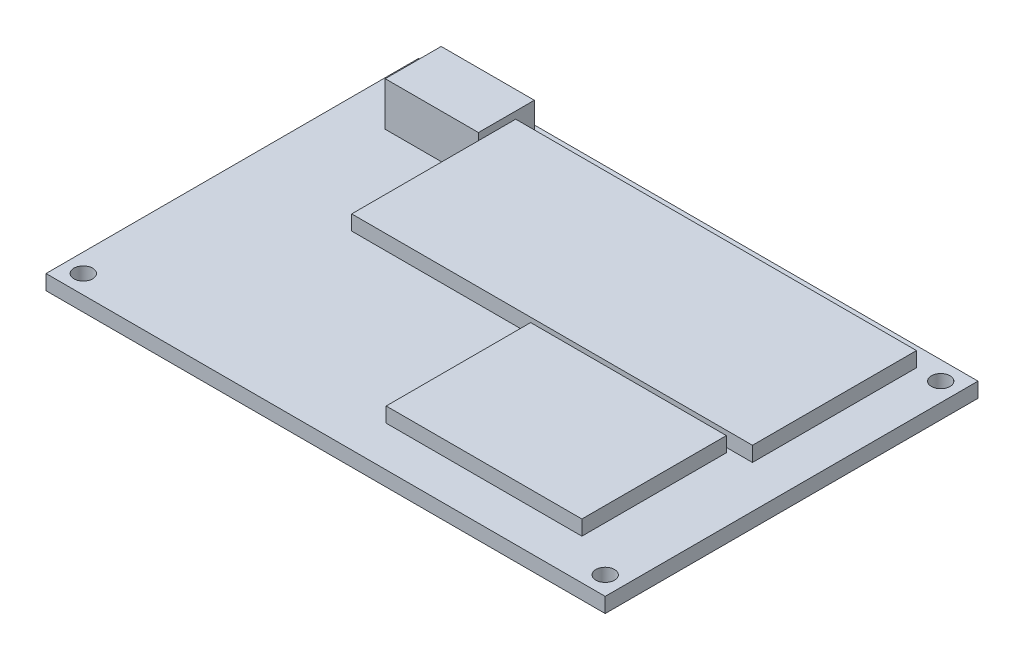
ISO-10303-21;
HEADER;
FILE_DESCRIPTION(('STEP AP214'),'2;1');
FILE_NAME('part.step','',(''),(''),'','','');
FILE_SCHEMA(('AUTOMOTIVE_DESIGN { 1 0 10303 214 1 1 1 1 }'));
ENDSEC;
DATA;
#1=APPLICATION_CONTEXT('core data for automotive mechanical design processes');
#2=APPLICATION_PROTOCOL_DEFINITION('international standard','automotive_design',2000,#1);
#3=PRODUCT_CONTEXT('',#1,'mechanical');
#4=PRODUCT('Part','Part','',(#3));
#5=PRODUCT_RELATED_PRODUCT_CATEGORY('part','',(#4));
#6=PRODUCT_DEFINITION_FORMATION('','',#4);
#7=PRODUCT_DEFINITION_CONTEXT('part definition',#1,'design');
#8=PRODUCT_DEFINITION('design','',#6,#7);
#9=PRODUCT_DEFINITION_SHAPE('','',#8);
#10=(LENGTH_UNIT() NAMED_UNIT(*) SI_UNIT(.MILLI.,.METRE.));
#11=(NAMED_UNIT(*) PLANE_ANGLE_UNIT() SI_UNIT($,.RADIAN.));
#12=(NAMED_UNIT(*) SI_UNIT($,.STERADIAN.) SOLID_ANGLE_UNIT());
#13=UNCERTAINTY_MEASURE_WITH_UNIT(LENGTH_MEASURE(1.E-05),#10,'distance_accuracy_value','');
#14=(GEOMETRIC_REPRESENTATION_CONTEXT(3) GLOBAL_UNCERTAINTY_ASSIGNED_CONTEXT((#13)) GLOBAL_UNIT_ASSIGNED_CONTEXT((#10,
#11,#12)) REPRESENTATION_CONTEXT('',''));
#15=CARTESIAN_POINT('',(0.,0.,0.));
#16=DIRECTION('',(0.,0.,1.));
#17=DIRECTION('',(1.,0.,0.));
#18=AXIS2_PLACEMENT_3D('',#15,#16,#17);
#19=CARTESIAN_POINT('',(25.7,5.74,2.7));
#20=DIRECTION('',(-1.,0.,0.));
#21=DIRECTION('',(0.,0.,1.));
#22=AXIS2_PLACEMENT_3D('',#19,#20,#21);
#23=PLANE('',#22);
#24=DIRECTION('',(0.,0.,-1.));
#25=VECTOR('',#24,1.);
#26=CARTESIAN_POINT('',(25.7,4.14,2.7));
#27=LINE('',#26,#25);
#28=CARTESIAN_POINT('',(25.7,4.14,18.2));
#29=VERTEX_POINT('',#28);
#30=CARTESIAN_POINT('',(25.7,4.14,2.7));
#31=VERTEX_POINT('',#30);
#32=EDGE_CURVE('E115',#29,#31,#27,.T.);
#33=ORIENTED_EDGE('',*,*,#32,.T.);
#34=DIRECTION('',(0.,-1.,0.));
#35=VECTOR('',#34,1.);
#36=CARTESIAN_POINT('',(25.7,5.74,2.7));
#37=LINE('',#36,#35);
#38=CARTESIAN_POINT('',(25.7,5.74,2.7));
#39=VERTEX_POINT('',#38);
#40=EDGE_CURVE('E12',#39,#31,#37,.T.);
#41=ORIENTED_EDGE('',*,*,#40,.F.);
#42=DIRECTION('',(0.,0.,-1.));
#43=VECTOR('',#42,1.);
#44=CARTESIAN_POINT('',(25.7,5.74,2.7));
#45=LINE('',#44,#43);
#46=CARTESIAN_POINT('',(25.7,5.74,18.2));
#47=VERTEX_POINT('',#46);
#48=EDGE_CURVE('E103',#47,#39,#45,.T.);
#49=ORIENTED_EDGE('',*,*,#48,.F.);
#50=DIRECTION('',(0.,-1.,0.));
#51=VECTOR('',#50,1.);
#52=CARTESIAN_POINT('',(25.7,5.74,18.2));
#53=LINE('',#52,#51);
#54=EDGE_CURVE('E111',#47,#29,#53,.T.);
#55=ORIENTED_EDGE('',*,*,#54,.T.);
#56=EDGE_LOOP('',(#33,#41,#49,#55));
#57=FACE_BOUND('',#56,.T.);
#58=ADVANCED_FACE('F52',(#57),#23,.F.);
#59=CARTESIAN_POINT('',(25.7,5.74,2.7));
#60=DIRECTION('',(0.,0.,1.));
#61=DIRECTION('',(1.,0.,0.));
#62=AXIS2_PLACEMENT_3D('',#59,#60,#61);
#63=PLANE('',#62);
#64=DIRECTION('',(-1.,0.,0.));
#65=VECTOR('',#64,1.);
#66=CARTESIAN_POINT('',(25.7,4.14,2.7));
#67=LINE('',#66,#65);
#68=CARTESIAN_POINT('',(4.7,4.14,2.7));
#69=VERTEX_POINT('',#68);
#70=EDGE_CURVE('E107',#31,#69,#67,.T.);
#71=ORIENTED_EDGE('',*,*,#70,.T.);
#72=DIRECTION('',(0.,-1.,0.));
#73=VECTOR('',#72,1.);
#74=CARTESIAN_POINT('',(4.7,5.74,2.7));
#75=LINE('',#74,#73);
#76=CARTESIAN_POINT('',(4.7,5.74,2.7));
#77=VERTEX_POINT('',#76);
#78=EDGE_CURVE('E60',#77,#69,#75,.T.);
#79=ORIENTED_EDGE('',*,*,#78,.F.);
#80=DIRECTION('',(-1.,0.,0.));
#81=VECTOR('',#80,1.);
#82=CARTESIAN_POINT('',(25.7,5.74,2.7));
#83=LINE('',#82,#81);
#84=EDGE_CURVE('E98',#39,#77,#83,.T.);
#85=ORIENTED_EDGE('',*,*,#84,.F.);
#86=ORIENTED_EDGE('',*,*,#40,.T.);
#87=EDGE_LOOP('',(#71,#79,#85,#86));
#88=FACE_BOUND('',#87,.T.);
#89=ADVANCED_FACE('F106',(#88),#63,.F.);
#90=CARTESIAN_POINT('',(4.7,5.74,2.7));
#91=DIRECTION('',(1.,0.,0.));
#92=DIRECTION('',(0.,0.,-1.));
#93=AXIS2_PLACEMENT_3D('',#90,#91,#92);
#94=PLANE('',#93);
#95=DIRECTION('',(0.,0.,1.));
#96=VECTOR('',#95,1.);
#97=CARTESIAN_POINT('',(4.7,4.14,2.7));
#98=LINE('',#97,#96);
#99=CARTESIAN_POINT('',(4.7,4.14,18.2));
#100=VERTEX_POINT('',#99);
#101=EDGE_CURVE('E85',#69,#100,#98,.T.);
#102=ORIENTED_EDGE('',*,*,#101,.T.);
#103=DIRECTION('',(0.,-1.,0.));
#104=VECTOR('',#103,1.);
#105=CARTESIAN_POINT('',(4.7,5.74,18.2));
#106=LINE('',#105,#104);
#107=CARTESIAN_POINT('',(4.7,5.74,18.2));
#108=VERTEX_POINT('',#107);
#109=EDGE_CURVE('E108',#108,#100,#106,.T.);
#110=ORIENTED_EDGE('',*,*,#109,.F.);
#111=DIRECTION('',(0.,0.,1.));
#112=VECTOR('',#111,1.);
#113=CARTESIAN_POINT('',(4.7,5.74,2.7));
#114=LINE('',#113,#112);
#115=EDGE_CURVE('E101',#77,#108,#114,.T.);
#116=ORIENTED_EDGE('',*,*,#115,.F.);
#117=ORIENTED_EDGE('',*,*,#78,.T.);
#118=EDGE_LOOP('',(#102,#110,#116,#117));
#119=FACE_BOUND('',#118,.T.);
#120=ADVANCED_FACE('F109',(#119),#94,.F.);
#121=CARTESIAN_POINT('',(25.7,5.74,18.2));
#122=DIRECTION('',(0.,0.,-1.));
#123=DIRECTION('',(-1.,0.,0.));
#124=AXIS2_PLACEMENT_3D('',#121,#122,#123);
#125=PLANE('',#124);
#126=DIRECTION('',(1.,0.,0.));
#127=VECTOR('',#126,1.);
#128=CARTESIAN_POINT('',(25.7,4.14,18.2));
#129=LINE('',#128,#127);
#130=EDGE_CURVE('E91',#100,#29,#129,.T.);
#131=ORIENTED_EDGE('',*,*,#130,.T.);
#132=ORIENTED_EDGE('',*,*,#54,.F.);
#133=DIRECTION('',(1.,0.,0.));
#134=VECTOR('',#133,1.);
#135=CARTESIAN_POINT('',(25.7,5.74,18.2));
#136=LINE('',#135,#134);
#137=EDGE_CURVE('E68',#108,#47,#136,.T.);
#138=ORIENTED_EDGE('',*,*,#137,.F.);
#139=ORIENTED_EDGE('',*,*,#109,.T.);
#140=EDGE_LOOP('',(#131,#132,#138,#139));
#141=FACE_BOUND('',#140,.T.);
#142=ADVANCED_FACE('F122',(#141),#125,.F.);
#143=CARTESIAN_POINT('',(0.,5.74,0.));
#144=DIRECTION('',(0.,-1.,0.));
#145=DIRECTION('',(0.,0.,-1.));
#146=AXIS2_PLACEMENT_3D('',#143,#144,#145);
#147=PLANE('',#146);
#148=ORIENTED_EDGE('',*,*,#48,.T.);
#149=ORIENTED_EDGE('',*,*,#84,.T.);
#150=ORIENTED_EDGE('',*,*,#115,.T.);
#151=ORIENTED_EDGE('',*,*,#137,.T.);
#152=EDGE_LOOP('',(#148,#149,#150,#151));
#153=FACE_BOUND('',#152,.T.);
#154=ADVANCED_FACE('F99',(#153),#147,.F.);
#155=CARTESIAN_POINT('',(0.,4.14,0.));
#156=DIRECTION('',(0.,-1.,0.));
#157=DIRECTION('',(0.,0.,-1.));
#158=AXIS2_PLACEMENT_3D('',#155,#156,#157);
#159=PLANE('',#158);
#160=ORIENTED_EDGE('',*,*,#32,.F.);
#161=ORIENTED_EDGE('',*,*,#130,.F.);
#162=ORIENTED_EDGE('',*,*,#101,.F.);
#163=ORIENTED_EDGE('',*,*,#70,.F.);
#164=EDGE_LOOP('',(#160,#161,#162,#163));
#165=FACE_BOUND('',#164,.T.);
#166=ADVANCED_FACE('F125',(#165),#159,.T.);
#167=CLOSED_SHELL('',(#58,#89,#120,#142,#154,#166));
#168=MANIFOLD_SOLID_BREP('B2',#167);
#169=CARTESIAN_POINT('',(28.,5.74,-15.4));
#170=DIRECTION('',(-1.,0.,0.));
#171=DIRECTION('',(0.,0.,1.));
#172=AXIS2_PLACEMENT_3D('',#169,#170,#171);
#173=PLANE('',#172);
#174=DIRECTION('',(0.,0.,-1.));
#175=VECTOR('',#174,1.);
#176=CARTESIAN_POINT('',(28.,4.14,-15.4));
#177=LINE('',#176,#175);
#178=CARTESIAN_POINT('',(28.,4.14,2.2));
#179=VERTEX_POINT('',#178);
#180=CARTESIAN_POINT('',(28.,4.14,-15.4));
#181=VERTEX_POINT('',#180);
#182=EDGE_CURVE('E248',#179,#181,#177,.T.);
#183=ORIENTED_EDGE('',*,*,#182,.T.);
#184=DIRECTION('',(0.,-1.,0.));
#185=VECTOR('',#184,1.);
#186=CARTESIAN_POINT('',(28.,5.74,-15.4));
#187=LINE('',#186,#185);
#188=CARTESIAN_POINT('',(28.,5.74,-15.4));
#189=VERTEX_POINT('',#188);
#190=EDGE_CURVE('E50',#189,#181,#187,.T.);
#191=ORIENTED_EDGE('',*,*,#190,.F.);
#192=DIRECTION('',(0.,0.,-1.));
#193=VECTOR('',#192,1.);
#194=CARTESIAN_POINT('',(28.,5.74,-15.4));
#195=LINE('',#194,#193);
#196=CARTESIAN_POINT('',(28.,5.74,2.2));
#197=VERTEX_POINT('',#196);
#198=EDGE_CURVE('E236',#197,#189,#195,.T.);
#199=ORIENTED_EDGE('',*,*,#198,.F.);
#200=DIRECTION('',(0.,-1.,0.));
#201=VECTOR('',#200,1.);
#202=CARTESIAN_POINT('',(28.,5.74,2.2));
#203=LINE('',#202,#201);
#204=EDGE_CURVE('E244',#197,#179,#203,.T.);
#205=ORIENTED_EDGE('',*,*,#204,.T.);
#206=EDGE_LOOP('',(#183,#191,#199,#205));
#207=FACE_BOUND('',#206,.T.);
#208=ADVANCED_FACE('F185',(#207),#173,.F.);
#209=CARTESIAN_POINT('',(28.,5.74,-15.4));
#210=DIRECTION('',(0.,0.,1.));
#211=DIRECTION('',(1.,0.,0.));
#212=AXIS2_PLACEMENT_3D('',#209,#210,#211);
#213=PLANE('',#212);
#214=DIRECTION('',(-1.,0.,0.));
#215=VECTOR('',#214,1.);
#216=CARTESIAN_POINT('',(28.,4.14,-15.4));
#217=LINE('',#216,#215);
#218=CARTESIAN_POINT('',(-15.,4.14,-15.4));
#219=VERTEX_POINT('',#218);
#220=EDGE_CURVE('E240',#181,#219,#217,.T.);
#221=ORIENTED_EDGE('',*,*,#220,.T.);
#222=DIRECTION('',(0.,-1.,0.));
#223=VECTOR('',#222,1.);
#224=CARTESIAN_POINT('',(-15.,5.74,-15.4));
#225=LINE('',#224,#223);
#226=CARTESIAN_POINT('',(-15.,5.74,-15.4));
#227=VERTEX_POINT('',#226);
#228=EDGE_CURVE('E193',#227,#219,#225,.T.);
#229=ORIENTED_EDGE('',*,*,#228,.F.);
#230=DIRECTION('',(-1.,0.,0.));
#231=VECTOR('',#230,1.);
#232=CARTESIAN_POINT('',(28.,5.74,-15.4));
#233=LINE('',#232,#231);
#234=EDGE_CURVE('E231',#189,#227,#233,.T.);
#235=ORIENTED_EDGE('',*,*,#234,.F.);
#236=ORIENTED_EDGE('',*,*,#190,.T.);
#237=EDGE_LOOP('',(#221,#229,#235,#236));
#238=FACE_BOUND('',#237,.T.);
#239=ADVANCED_FACE('F239',(#238),#213,.F.);
#240=CARTESIAN_POINT('',(-15.,5.74,-15.4));
#241=DIRECTION('',(1.,0.,0.));
#242=DIRECTION('',(0.,0.,-1.));
#243=AXIS2_PLACEMENT_3D('',#240,#241,#242);
#244=PLANE('',#243);
#245=DIRECTION('',(0.,0.,1.));
#246=VECTOR('',#245,1.);
#247=CARTESIAN_POINT('',(-15.,4.14,-15.4));
#248=LINE('',#247,#246);
#249=CARTESIAN_POINT('',(-15.,4.14,2.2));
#250=VERTEX_POINT('',#249);
#251=EDGE_CURVE('E218',#219,#250,#248,.T.);
#252=ORIENTED_EDGE('',*,*,#251,.T.);
#253=DIRECTION('',(0.,-1.,0.));
#254=VECTOR('',#253,1.);
#255=CARTESIAN_POINT('',(-15.,5.74,2.2));
#256=LINE('',#255,#254);
#257=CARTESIAN_POINT('',(-15.,5.74,2.2));
#258=VERTEX_POINT('',#257);
#259=EDGE_CURVE('E241',#258,#250,#256,.T.);
#260=ORIENTED_EDGE('',*,*,#259,.F.);
#261=DIRECTION('',(0.,0.,1.));
#262=VECTOR('',#261,1.);
#263=CARTESIAN_POINT('',(-15.,5.74,-15.4));
#264=LINE('',#263,#262);
#265=EDGE_CURVE('E234',#227,#258,#264,.T.);
#266=ORIENTED_EDGE('',*,*,#265,.F.);
#267=ORIENTED_EDGE('',*,*,#228,.T.);
#268=EDGE_LOOP('',(#252,#260,#266,#267));
#269=FACE_BOUND('',#268,.T.);
#270=ADVANCED_FACE('F242',(#269),#244,.F.);
#271=CARTESIAN_POINT('',(28.,5.74,2.2));
#272=DIRECTION('',(0.,0.,-1.));
#273=DIRECTION('',(-1.,0.,0.));
#274=AXIS2_PLACEMENT_3D('',#271,#272,#273);
#275=PLANE('',#274);
#276=DIRECTION('',(1.,0.,0.));
#277=VECTOR('',#276,1.);
#278=CARTESIAN_POINT('',(28.,4.14,2.2));
#279=LINE('',#278,#277);
#280=EDGE_CURVE('E224',#250,#179,#279,.T.);
#281=ORIENTED_EDGE('',*,*,#280,.T.);
#282=ORIENTED_EDGE('',*,*,#204,.F.);
#283=DIRECTION('',(1.,0.,0.));
#284=VECTOR('',#283,1.);
#285=CARTESIAN_POINT('',(28.,5.74,2.2));
#286=LINE('',#285,#284);
#287=EDGE_CURVE('E201',#258,#197,#286,.T.);
#288=ORIENTED_EDGE('',*,*,#287,.F.);
#289=ORIENTED_EDGE('',*,*,#259,.T.);
#290=EDGE_LOOP('',(#281,#282,#288,#289));
#291=FACE_BOUND('',#290,.T.);
#292=ADVANCED_FACE('F255',(#291),#275,.F.);
#293=CARTESIAN_POINT('',(0.,5.74,0.));
#294=DIRECTION('',(0.,-1.,0.));
#295=DIRECTION('',(0.,0.,-1.));
#296=AXIS2_PLACEMENT_3D('',#293,#294,#295);
#297=PLANE('',#296);
#298=ORIENTED_EDGE('',*,*,#198,.T.);
#299=ORIENTED_EDGE('',*,*,#234,.T.);
#300=ORIENTED_EDGE('',*,*,#265,.T.);
#301=ORIENTED_EDGE('',*,*,#287,.T.);
#302=EDGE_LOOP('',(#298,#299,#300,#301));
#303=FACE_BOUND('',#302,.T.);
#304=ADVANCED_FACE('F232',(#303),#297,.F.);
#305=CARTESIAN_POINT('',(0.,4.14,0.));
#306=DIRECTION('',(0.,-1.,0.));
#307=DIRECTION('',(0.,0.,-1.));
#308=AXIS2_PLACEMENT_3D('',#305,#306,#307);
#309=PLANE('',#308);
#310=ORIENTED_EDGE('',*,*,#182,.F.);
#311=ORIENTED_EDGE('',*,*,#280,.F.);
#312=ORIENTED_EDGE('',*,*,#251,.F.);
#313=ORIENTED_EDGE('',*,*,#220,.F.);
#314=EDGE_LOOP('',(#310,#311,#312,#313));
#315=FACE_BOUND('',#314,.T.);
#316=ADVANCED_FACE('F258',(#315),#309,.T.);
#317=CLOSED_SHELL('',(#208,#239,#270,#292,#304,#316));
#318=MANIFOLD_SOLID_BREP('B6',#317);
#319=CARTESIAN_POINT('',(0.,1.6,0.));
#320=DIRECTION('',(0.,1.,0.));
#321=DIRECTION('',(0.,0.,1.));
#322=AXIS2_PLACEMENT_3D('',#319,#320,#321);
#323=PLANE('',#322);
#324=CARTESIAN_POINT('',(28.,1.6,18.));
#325=DIRECTION('',(0.,1.,0.));
#326=DIRECTION('',(0.,0.,1.));
#327=AXIS2_PLACEMENT_3D('',#324,#325,#326);
#328=CIRCLE('',#327,1.);
#329=CARTESIAN_POINT('',(28.,1.6,19.));
#330=VERTEX_POINT('',#329);
#331=EDGE_CURVE('E426',#330,#330,#328,.T.);
#332=ORIENTED_EDGE('',*,*,#331,.F.);
#333=EDGE_LOOP('',(#332));
#334=FACE_BOUND('',#333,.T.);
#335=CARTESIAN_POINT('',(-28.,1.6,-18.));
#336=DIRECTION('',(0.,1.,0.));
#337=DIRECTION('',(0.,0.,1.));
#338=AXIS2_PLACEMENT_3D('',#335,#336,#337);
#339=CIRCLE('',#338,1.);
#340=CARTESIAN_POINT('',(-28.,1.6,-17.));
#341=VERTEX_POINT('',#340);
#342=EDGE_CURVE('E442',#341,#341,#339,.T.);
#343=ORIENTED_EDGE('',*,*,#342,.F.);
#344=EDGE_LOOP('',(#343));
#345=FACE_BOUND('',#344,.T.);
#346=DIRECTION('',(0.,0.,-1.));
#347=VECTOR('',#346,1.);
#348=CARTESIAN_POINT('',(30.,1.6,-20.));
#349=LINE('',#348,#347);
#350=CARTESIAN_POINT('',(30.,1.6,20.));
#351=VERTEX_POINT('',#350);
#352=CARTESIAN_POINT('',(30.,1.6,-20.));
#353=VERTEX_POINT('',#352);
#354=EDGE_CURVE('E450',#351,#353,#349,.T.);
#355=ORIENTED_EDGE('',*,*,#354,.T.);
#356=DIRECTION('',(-1.,0.,0.));
#357=VECTOR('',#356,1.);
#358=CARTESIAN_POINT('',(-30.,1.6,-20.));
#359=LINE('',#358,#357);
#360=CARTESIAN_POINT('',(-30.,1.6,-20.));
#361=VERTEX_POINT('',#360);
#362=EDGE_CURVE('E362',#353,#361,#359,.T.);
#363=ORIENTED_EDGE('',*,*,#362,.T.);
#364=DIRECTION('',(0.,0.,1.));
#365=VECTOR('',#364,1.);
#366=CARTESIAN_POINT('',(-30.,1.6,-20.));
#367=LINE('',#366,#365);
#368=CARTESIAN_POINT('',(-30.,1.6,20.));
#369=VERTEX_POINT('',#368);
#370=EDGE_CURVE('E455',#361,#369,#367,.T.);
#371=ORIENTED_EDGE('',*,*,#370,.T.);
#372=DIRECTION('',(1.,0.,0.));
#373=VECTOR('',#372,1.);
#374=CARTESIAN_POINT('',(-30.,1.6,20.));
#375=LINE('',#374,#373);
#376=EDGE_CURVE('E334',#369,#351,#375,.T.);
#377=ORIENTED_EDGE('',*,*,#376,.T.);
#378=EDGE_LOOP('',(#355,#363,#371,#377));
#379=FACE_BOUND('',#378,.T.);
#380=CARTESIAN_POINT('',(28.,1.6,-18.));
#381=DIRECTION('',(0.,1.,0.));
#382=DIRECTION('',(0.,0.,-1.));
#383=AXIS2_PLACEMENT_3D('',#380,#381,#382);
#384=CIRCLE('',#383,1.);
#385=CARTESIAN_POINT('',(28.,1.6,-19.));
#386=VERTEX_POINT('',#385);
#387=EDGE_CURVE('E434',#386,#386,#384,.T.);
#388=ORIENTED_EDGE('',*,*,#387,.F.);
#389=EDGE_LOOP('',(#388));
#390=FACE_BOUND('',#389,.T.);
#391=CARTESIAN_POINT('',(-28.,1.6,18.));
#392=DIRECTION('',(0.,1.,0.));
#393=DIRECTION('',(0.,0.,-1.));
#394=AXIS2_PLACEMENT_3D('',#391,#392,#393);
#395=CIRCLE('',#394,1.);
#396=CARTESIAN_POINT('',(-28.,1.6,17.));
#397=VERTEX_POINT('',#396);
#398=EDGE_CURVE('E417',#397,#397,#395,.T.);
#399=ORIENTED_EDGE('',*,*,#398,.F.);
#400=EDGE_LOOP('',(#399));
#401=FACE_BOUND('',#400,.T.);
#402=DIRECTION('',(1.,0.,0.));
#403=VECTOR('',#402,1.);
#404=CARTESIAN_POINT('',(-25.2,1.6,-11.6));
#405=LINE('',#404,#403);
#406=CARTESIAN_POINT('',(-25.2,1.6,-11.6));
#407=VERTEX_POINT('',#406);
#408=CARTESIAN_POINT('',(-15.2,1.6,-11.6));
#409=VERTEX_POINT('',#408);
#410=EDGE_CURVE('E633',#407,#409,#405,.T.);
#411=ORIENTED_EDGE('',*,*,#410,.F.);
#412=DIRECTION('',(0.,0.,1.));
#413=VECTOR('',#412,1.);
#414=CARTESIAN_POINT('',(-25.2,1.6,-17.6));
#415=LINE('',#414,#413);
#416=CARTESIAN_POINT('',(-25.2,1.6,-17.6));
#417=VERTEX_POINT('',#416);
#418=EDGE_CURVE('E409',#417,#407,#415,.T.);
#419=ORIENTED_EDGE('',*,*,#418,.F.);
#420=DIRECTION('',(-1.,0.,0.));
#421=VECTOR('',#420,1.);
#422=CARTESIAN_POINT('',(-25.2,1.6,-17.6));
#423=LINE('',#422,#421);
#424=CARTESIAN_POINT('',(-15.2,1.6,-17.6));
#425=VERTEX_POINT('',#424);
#426=EDGE_CURVE('E405',#425,#417,#423,.T.);
#427=ORIENTED_EDGE('',*,*,#426,.F.);
#428=DIRECTION('',(0.,0.,-1.));
#429=VECTOR('',#428,1.);
#430=CARTESIAN_POINT('',(-15.2,1.6,-17.6));
#431=LINE('',#430,#429);
#432=EDGE_CURVE('E629',#409,#425,#431,.T.);
#433=ORIENTED_EDGE('',*,*,#432,.F.);
#434=EDGE_LOOP('',(#411,#419,#427,#433));
#435=FACE_BOUND('',#434,.T.);
#436=ADVANCED_FACE('F309',(#334,#345,#379,#390,#401,#435),#323,.T.);
#437=CARTESIAN_POINT('',(0.,0.,0.));
#438=DIRECTION('',(0.,1.,0.));
#439=DIRECTION('',(0.,0.,1.));
#440=AXIS2_PLACEMENT_3D('',#437,#438,#439);
#441=PLANE('',#440);
#442=DIRECTION('',(0.,0.,-1.));
#443=VECTOR('',#442,1.);
#444=CARTESIAN_POINT('',(30.,0.,-20.));
#445=LINE('',#444,#443);
#446=CARTESIAN_POINT('',(30.,0.,20.));
#447=VERTEX_POINT('',#446);
#448=CARTESIAN_POINT('',(30.,0.,-20.));
#449=VERTEX_POINT('',#448);
#450=EDGE_CURVE('E446',#447,#449,#445,.T.);
#451=ORIENTED_EDGE('',*,*,#450,.F.);
#452=DIRECTION('',(1.,0.,0.));
#453=VECTOR('',#452,1.);
#454=CARTESIAN_POINT('',(-30.,0.,20.));
#455=LINE('',#454,#453);
#456=CARTESIAN_POINT('',(-30.,0.,20.));
#457=VERTEX_POINT('',#456);
#458=EDGE_CURVE('E355',#457,#447,#455,.T.);
#459=ORIENTED_EDGE('',*,*,#458,.F.);
#460=DIRECTION('',(0.,0.,1.));
#461=VECTOR('',#460,1.);
#462=CARTESIAN_POINT('',(-30.,0.,-20.));
#463=LINE('',#462,#461);
#464=CARTESIAN_POINT('',(-30.,0.,-20.));
#465=VERTEX_POINT('',#464);
#466=EDGE_CURVE('E467',#465,#457,#463,.T.);
#467=ORIENTED_EDGE('',*,*,#466,.F.);
#468=DIRECTION('',(-1.,0.,0.));
#469=VECTOR('',#468,1.);
#470=CARTESIAN_POINT('',(-30.,0.,-20.));
#471=LINE('',#470,#469);
#472=EDGE_CURVE('E464',#449,#465,#471,.T.);
#473=ORIENTED_EDGE('',*,*,#472,.F.);
#474=EDGE_LOOP('',(#451,#459,#467,#473));
#475=FACE_BOUND('',#474,.T.);
#476=CARTESIAN_POINT('',(-28.,0.,-18.));
#477=DIRECTION('',(0.,1.,0.));
#478=DIRECTION('',(0.,0.,1.));
#479=AXIS2_PLACEMENT_3D('',#476,#477,#478);
#480=CIRCLE('',#479,1.);
#481=CARTESIAN_POINT('',(-28.,0.,-17.));
#482=VERTEX_POINT('',#481);
#483=EDGE_CURVE('E438',#482,#482,#480,.T.);
#484=ORIENTED_EDGE('',*,*,#483,.T.);
#485=EDGE_LOOP('',(#484));
#486=FACE_BOUND('',#485,.T.);
#487=CARTESIAN_POINT('',(28.,0.,-18.));
#488=DIRECTION('',(0.,1.,0.));
#489=DIRECTION('',(0.,0.,-1.));
#490=AXIS2_PLACEMENT_3D('',#487,#488,#489);
#491=CIRCLE('',#490,1.);
#492=CARTESIAN_POINT('',(28.,0.,-19.));
#493=VERTEX_POINT('',#492);
#494=EDGE_CURVE('E430',#493,#493,#491,.T.);
#495=ORIENTED_EDGE('',*,*,#494,.T.);
#496=EDGE_LOOP('',(#495));
#497=FACE_BOUND('',#496,.T.);
#498=CARTESIAN_POINT('',(28.,0.,18.));
#499=DIRECTION('',(0.,1.,0.));
#500=DIRECTION('',(0.,0.,1.));
#501=AXIS2_PLACEMENT_3D('',#498,#499,#500);
#502=CIRCLE('',#501,1.);
#503=CARTESIAN_POINT('',(28.,0.,19.));
#504=VERTEX_POINT('',#503);
#505=EDGE_CURVE('E424',#504,#504,#502,.T.);
#506=ORIENTED_EDGE('',*,*,#505,.T.);
#507=EDGE_LOOP('',(#506));
#508=FACE_BOUND('',#507,.T.);
#509=CARTESIAN_POINT('',(-28.,0.,18.));
#510=DIRECTION('',(0.,1.,0.));
#511=DIRECTION('',(0.,0.,-1.));
#512=AXIS2_PLACEMENT_3D('',#509,#510,#511);
#513=CIRCLE('',#512,1.);
#514=CARTESIAN_POINT('',(-28.,0.,17.));
#515=VERTEX_POINT('',#514);
#516=EDGE_CURVE('E412',#515,#515,#513,.T.);
#517=ORIENTED_EDGE('',*,*,#516,.T.);
#518=EDGE_LOOP('',(#517));
#519=FACE_BOUND('',#518,.T.);
#520=ADVANCED_FACE('F485',(#475,#486,#497,#508,#519),#441,.F.);
#521=CARTESIAN_POINT('',(30.,1.6,-20.));
#522=DIRECTION('',(-1.,0.,0.));
#523=DIRECTION('',(0.,0.,1.));
#524=AXIS2_PLACEMENT_3D('',#521,#522,#523);
#525=PLANE('',#524);
#526=ORIENTED_EDGE('',*,*,#450,.T.);
#527=DIRECTION('',(0.,-1.,0.));
#528=VECTOR('',#527,1.);
#529=CARTESIAN_POINT('',(30.,1.6,-20.));
#530=LINE('',#529,#528);
#531=EDGE_CURVE('E183',#353,#449,#530,.T.);
#532=ORIENTED_EDGE('',*,*,#531,.F.);
#533=ORIENTED_EDGE('',*,*,#354,.F.);
#534=DIRECTION('',(0.,-1.,0.));
#535=VECTOR('',#534,1.);
#536=CARTESIAN_POINT('',(30.,1.6,20.));
#537=LINE('',#536,#535);
#538=EDGE_CURVE('E460',#351,#447,#537,.T.);
#539=ORIENTED_EDGE('',*,*,#538,.T.);
#540=EDGE_LOOP('',(#526,#532,#533,#539));
#541=FACE_BOUND('',#540,.T.);
#542=ADVANCED_FACE('F311',(#541),#525,.F.);
#543=CARTESIAN_POINT('',(-30.,1.6,-20.));
#544=DIRECTION('',(0.,0.,1.));
#545=DIRECTION('',(1.,0.,0.));
#546=AXIS2_PLACEMENT_3D('',#543,#544,#545);
#547=PLANE('',#546);
#548=ORIENTED_EDGE('',*,*,#472,.T.);
#549=DIRECTION('',(0.,-1.,0.));
#550=VECTOR('',#549,1.);
#551=CARTESIAN_POINT('',(-30.,1.6,-20.));
#552=LINE('',#551,#550);
#553=EDGE_CURVE('E318',#361,#465,#552,.T.);
#554=ORIENTED_EDGE('',*,*,#553,.F.);
#555=ORIENTED_EDGE('',*,*,#362,.F.);
#556=ORIENTED_EDGE('',*,*,#531,.T.);
#557=EDGE_LOOP('',(#548,#554,#555,#556));
#558=FACE_BOUND('',#557,.T.);
#559=ADVANCED_FACE('F501',(#558),#547,.F.);
#560=CARTESIAN_POINT('',(-30.,1.6,-20.));
#561=DIRECTION('',(1.,0.,0.));
#562=DIRECTION('',(0.,0.,-1.));
#563=AXIS2_PLACEMENT_3D('',#560,#561,#562);
#564=PLANE('',#563);
#565=ORIENTED_EDGE('',*,*,#466,.T.);
#566=DIRECTION('',(0.,-1.,0.));
#567=VECTOR('',#566,1.);
#568=CARTESIAN_POINT('',(-30.,1.6,20.));
#569=LINE('',#568,#567);
#570=EDGE_CURVE('E474',#369,#457,#569,.T.);
#571=ORIENTED_EDGE('',*,*,#570,.F.);
#572=ORIENTED_EDGE('',*,*,#370,.F.);
#573=ORIENTED_EDGE('',*,*,#553,.T.);
#574=EDGE_LOOP('',(#565,#571,#572,#573));
#575=FACE_BOUND('',#574,.T.);
#576=ADVANCED_FACE('F481',(#575),#564,.F.);
#577=CARTESIAN_POINT('',(-30.,1.6,20.));
#578=DIRECTION('',(0.,0.,-1.));
#579=DIRECTION('',(-1.,0.,0.));
#580=AXIS2_PLACEMENT_3D('',#577,#578,#579);
#581=PLANE('',#580);
#582=ORIENTED_EDGE('',*,*,#458,.T.);
#583=ORIENTED_EDGE('',*,*,#538,.F.);
#584=ORIENTED_EDGE('',*,*,#376,.F.);
#585=ORIENTED_EDGE('',*,*,#570,.T.);
#586=EDGE_LOOP('',(#582,#583,#584,#585));
#587=FACE_BOUND('',#586,.T.);
#588=ADVANCED_FACE('F490',(#587),#581,.F.);
#589=CARTESIAN_POINT('',(-28.,1.6,-18.));
#590=DIRECTION('',(0.,-1.,0.));
#591=DIRECTION('',(0.,0.,-1.));
#592=AXIS2_PLACEMENT_3D('',#589,#590,#591);
#593=CYLINDRICAL_SURFACE('',#592,1.);
#594=ORIENTED_EDGE('',*,*,#342,.T.);
#595=EDGE_LOOP('',(#594));
#596=FACE_BOUND('',#595,.T.);
#597=ORIENTED_EDGE('',*,*,#483,.F.);
#598=EDGE_LOOP('',(#597));
#599=FACE_BOUND('',#598,.T.);
#600=ADVANCED_FACE('F492',(#596,#599),#593,.F.);
#601=CARTESIAN_POINT('',(28.,1.6,-18.));
#602=DIRECTION('',(0.,-1.,0.));
#603=DIRECTION('',(0.,0.,-1.));
#604=AXIS2_PLACEMENT_3D('',#601,#602,#603);
#605=CYLINDRICAL_SURFACE('',#604,1.);
#606=ORIENTED_EDGE('',*,*,#387,.T.);
#607=EDGE_LOOP('',(#606));
#608=FACE_BOUND('',#607,.T.);
#609=ORIENTED_EDGE('',*,*,#494,.F.);
#610=EDGE_LOOP('',(#609));
#611=FACE_BOUND('',#610,.T.);
#612=ADVANCED_FACE('F498',(#608,#611),#605,.F.);
#613=CARTESIAN_POINT('',(28.,1.6,18.));
#614=DIRECTION('',(0.,-1.,0.));
#615=DIRECTION('',(0.,0.,-1.));
#616=AXIS2_PLACEMENT_3D('',#613,#614,#615);
#617=CYLINDRICAL_SURFACE('',#616,1.);
#618=ORIENTED_EDGE('',*,*,#331,.T.);
#619=EDGE_LOOP('',(#618));
#620=FACE_BOUND('',#619,.T.);
#621=ORIENTED_EDGE('',*,*,#505,.F.);
#622=EDGE_LOOP('',(#621));
#623=FACE_BOUND('',#622,.T.);
#624=ADVANCED_FACE('F515',(#620,#623),#617,.F.);
#625=CARTESIAN_POINT('',(-28.,1.6,18.));
#626=DIRECTION('',(0.,-1.,0.));
#627=DIRECTION('',(0.,0.,-1.));
#628=AXIS2_PLACEMENT_3D('',#625,#626,#627);
#629=CYLINDRICAL_SURFACE('',#628,1.);
#630=ORIENTED_EDGE('',*,*,#398,.T.);
#631=EDGE_LOOP('',(#630));
#632=FACE_BOUND('',#631,.T.);
#633=ORIENTED_EDGE('',*,*,#516,.F.);
#634=EDGE_LOOP('',(#633));
#635=FACE_BOUND('',#634,.T.);
#636=ADVANCED_FACE('F519',(#632,#635),#629,.F.);
#637=CARTESIAN_POINT('',(-25.2,6.3,-17.6));
#638=DIRECTION('',(1.,0.,0.));
#639=DIRECTION('',(0.,0.,-1.));
#640=AXIS2_PLACEMENT_3D('',#637,#638,#639);
#641=PLANE('',#640);
#642=ORIENTED_EDGE('',*,*,#418,.T.);
#643=DIRECTION('',(0.,-1.,0.));
#644=VECTOR('',#643,1.);
#645=CARTESIAN_POINT('',(-25.2,6.3,-11.6));
#646=LINE('',#645,#644);
#647=CARTESIAN_POINT('',(-25.2,6.3,-11.6));
#648=VERTEX_POINT('',#647);
#649=EDGE_CURVE('E388',#648,#407,#646,.T.);
#650=ORIENTED_EDGE('',*,*,#649,.F.);
#651=DIRECTION('',(0.,0.,1.));
#652=VECTOR('',#651,1.);
#653=CARTESIAN_POINT('',(-25.2,6.3,-17.6));
#654=LINE('',#653,#652);
#655=CARTESIAN_POINT('',(-25.2,6.3,-17.6));
#656=VERTEX_POINT('',#655);
#657=EDGE_CURVE('E396',#656,#648,#654,.T.);
#658=ORIENTED_EDGE('',*,*,#657,.F.);
#659=DIRECTION('',(0.,-1.,0.));
#660=VECTOR('',#659,1.);
#661=CARTESIAN_POINT('',(-25.2,6.3,-17.6));
#662=LINE('',#661,#660);
#663=EDGE_CURVE('E625',#656,#417,#662,.T.);
#664=ORIENTED_EDGE('',*,*,#663,.T.);
#665=EDGE_LOOP('',(#642,#650,#658,#664));
#666=FACE_BOUND('',#665,.T.);
#667=ADVANCED_FACE('F407',(#666),#641,.F.);
#668=CARTESIAN_POINT('',(-25.2,6.3,-11.6));
#669=DIRECTION('',(0.,0.,-1.));
#670=DIRECTION('',(-1.,0.,0.));
#671=AXIS2_PLACEMENT_3D('',#668,#669,#670);
#672=PLANE('',#671);
#673=ORIENTED_EDGE('',*,*,#410,.T.);
#674=DIRECTION('',(0.,-1.,0.));
#675=VECTOR('',#674,1.);
#676=CARTESIAN_POINT('',(-15.2,6.3,-11.6));
#677=LINE('',#676,#675);
#678=CARTESIAN_POINT('',(-15.2,6.3,-11.6));
#679=VERTEX_POINT('',#678);
#680=EDGE_CURVE('E391',#679,#409,#677,.T.);
#681=ORIENTED_EDGE('',*,*,#680,.F.);
#682=DIRECTION('',(1.,0.,0.));
#683=VECTOR('',#682,1.);
#684=CARTESIAN_POINT('',(-25.2,6.3,-11.6));
#685=LINE('',#684,#683);
#686=EDGE_CURVE('E384',#648,#679,#685,.T.);
#687=ORIENTED_EDGE('',*,*,#686,.F.);
#688=ORIENTED_EDGE('',*,*,#649,.T.);
#689=EDGE_LOOP('',(#673,#681,#687,#688));
#690=FACE_BOUND('',#689,.T.);
#691=ADVANCED_FACE('F386',(#690),#672,.F.);
#692=CARTESIAN_POINT('',(-15.2,6.3,-17.6));
#693=DIRECTION('',(-1.,0.,0.));
#694=DIRECTION('',(0.,0.,1.));
#695=AXIS2_PLACEMENT_3D('',#692,#693,#694);
#696=PLANE('',#695);
#697=ORIENTED_EDGE('',*,*,#432,.T.);
#698=DIRECTION('',(0.,-1.,0.));
#699=VECTOR('',#698,1.);
#700=CARTESIAN_POINT('',(-15.2,6.3,-17.6));
#701=LINE('',#700,#699);
#702=CARTESIAN_POINT('',(-15.2,6.3,-17.6));
#703=VERTEX_POINT('',#702);
#704=EDGE_CURVE('E325',#703,#425,#701,.T.);
#705=ORIENTED_EDGE('',*,*,#704,.F.);
#706=DIRECTION('',(0.,0.,-1.));
#707=VECTOR('',#706,1.);
#708=CARTESIAN_POINT('',(-15.2,6.3,-17.6));
#709=LINE('',#708,#707);
#710=EDGE_CURVE('E395',#679,#703,#709,.T.);
#711=ORIENTED_EDGE('',*,*,#710,.F.);
#712=ORIENTED_EDGE('',*,*,#680,.T.);
#713=EDGE_LOOP('',(#697,#705,#711,#712));
#714=FACE_BOUND('',#713,.T.);
#715=ADVANCED_FACE('F528',(#714),#696,.F.);
#716=CARTESIAN_POINT('',(-25.2,6.3,-17.6));
#717=DIRECTION('',(0.,0.,1.));
#718=DIRECTION('',(1.,0.,0.));
#719=AXIS2_PLACEMENT_3D('',#716,#717,#718);
#720=PLANE('',#719);
#721=ORIENTED_EDGE('',*,*,#426,.T.);
#722=ORIENTED_EDGE('',*,*,#663,.F.);
#723=DIRECTION('',(-1.,0.,0.));
#724=VECTOR('',#723,1.);
#725=CARTESIAN_POINT('',(-25.2,6.3,-17.6));
#726=LINE('',#725,#724);
#727=EDGE_CURVE('E400',#703,#656,#726,.T.);
#728=ORIENTED_EDGE('',*,*,#727,.F.);
#729=ORIENTED_EDGE('',*,*,#704,.T.);
#730=EDGE_LOOP('',(#721,#722,#728,#729));
#731=FACE_BOUND('',#730,.T.);
#732=ADVANCED_FACE('F531',(#731),#720,.F.);
#733=CARTESIAN_POINT('',(0.,6.3,0.));
#734=DIRECTION('',(0.,1.,0.));
#735=DIRECTION('',(0.,0.,1.));
#736=AXIS2_PLACEMENT_3D('',#733,#734,#735);
#737=PLANE('',#736);
#738=ORIENTED_EDGE('',*,*,#657,.T.);
#739=ORIENTED_EDGE('',*,*,#686,.T.);
#740=ORIENTED_EDGE('',*,*,#710,.T.);
#741=ORIENTED_EDGE('',*,*,#727,.T.);
#742=EDGE_LOOP('',(#738,#739,#740,#741));
#743=FACE_BOUND('',#742,.T.);
#744=ADVANCED_FACE('F399',(#743),#737,.T.);
#745=CLOSED_SHELL('',(#436,#520,#542,#559,#576,#588,#600,#612,#624,#636,#667,#691,#715,#732,#744));
#746=MANIFOLD_SOLID_BREP('B44',#745);
#747=ADVANCED_BREP_SHAPE_REPRESENTATION('',(#18,#168,#318,#746),#14);
#748=SHAPE_DEFINITION_REPRESENTATION(#9,#747);
ENDSEC;
END-ISO-10303-21;
